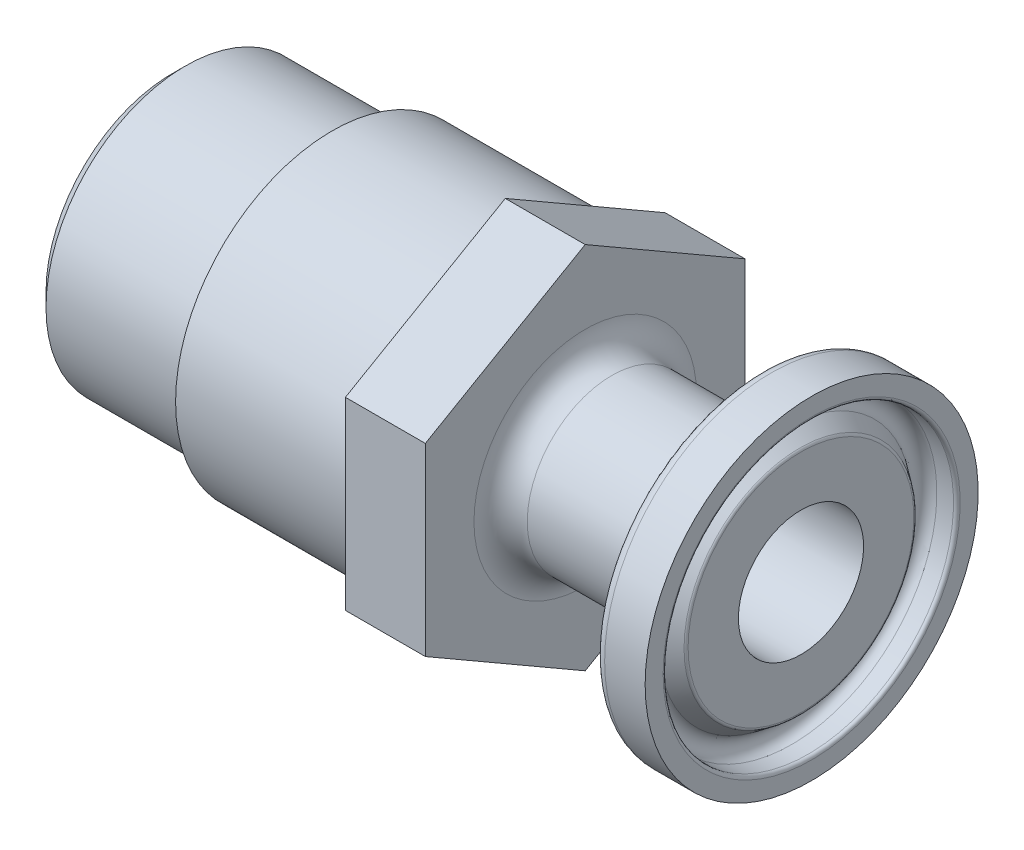
ISO-10303-21;
HEADER;
FILE_DESCRIPTION(('STEP AP214'),'2;1');
FILE_NAME('part.step','',(''),(''),'','','');
FILE_SCHEMA(('AUTOMOTIVE_DESIGN { 1 0 10303 214 1 1 1 1 }'));
ENDSEC;
DATA;
#1=APPLICATION_CONTEXT('core data for automotive mechanical design processes');
#2=APPLICATION_PROTOCOL_DEFINITION('international standard','automotive_design',2000,#1);
#3=PRODUCT_CONTEXT('',#1,'mechanical');
#4=PRODUCT('Part','Part','',(#3));
#5=PRODUCT_RELATED_PRODUCT_CATEGORY('part','',(#4));
#6=PRODUCT_DEFINITION_FORMATION('','',#4);
#7=PRODUCT_DEFINITION_CONTEXT('part definition',#1,'design');
#8=PRODUCT_DEFINITION('design','',#6,#7);
#9=PRODUCT_DEFINITION_SHAPE('','',#8);
#10=(LENGTH_UNIT() NAMED_UNIT(*) SI_UNIT(.MILLI.,.METRE.));
#11=(NAMED_UNIT(*) PLANE_ANGLE_UNIT() SI_UNIT($,.RADIAN.));
#12=(NAMED_UNIT(*) SI_UNIT($,.STERADIAN.) SOLID_ANGLE_UNIT());
#13=UNCERTAINTY_MEASURE_WITH_UNIT(LENGTH_MEASURE(1.E-05),#10,'distance_accuracy_value','');
#14=(GEOMETRIC_REPRESENTATION_CONTEXT(3) GLOBAL_UNCERTAINTY_ASSIGNED_CONTEXT((#13)) GLOBAL_UNIT_ASSIGNED_CONTEXT((#10,
#11,#12)) REPRESENTATION_CONTEXT('',''));
#15=CARTESIAN_POINT('',(0.,0.,0.));
#16=DIRECTION('',(0.,0.,1.));
#17=DIRECTION('',(1.,0.,0.));
#18=AXIS2_PLACEMENT_3D('',#15,#16,#17);
#19=CARTESIAN_POINT('',(25.,11.75,0.));
#20=DIRECTION('',(1.,0.,0.));
#21=DIRECTION('',(0.,0.,-1.));
#22=AXIS2_PLACEMENT_3D('',#19,#20,#21);
#23=PLANE('',#22);
#24=CARTESIAN_POINT('',(25.,0.,0.));
#25=DIRECTION('',(-1.,0.,0.));
#26=DIRECTION('',(0.,0.,1.));
#27=AXIS2_PLACEMENT_3D('',#24,#25,#26);
#28=CIRCLE('',#27,11.75);
#29=CARTESIAN_POINT('',(25.,0.,11.75));
#30=VERTEX_POINT('',#29);
#31=EDGE_CURVE('E155',#30,#30,#28,.T.);
#32=ORIENTED_EDGE('',*,*,#31,.F.);
#33=EDGE_LOOP('',(#32));
#34=FACE_BOUND('',#33,.T.);
#35=DIRECTION('',(0.,1.,0.));
#36=VECTOR('',#35,1.);
#37=CARTESIAN_POINT('',(25.,11.75,-12.));
#38=LINE('',#37,#36);
#39=CARTESIAN_POINT('',(25.,-6.92820323027551,-12.));
#40=VERTEX_POINT('',#39);
#41=CARTESIAN_POINT('',(25.,6.92820323027551,-12.));
#42=VERTEX_POINT('',#41);
#43=EDGE_CURVE('E127',#40,#42,#38,.T.);
#44=ORIENTED_EDGE('',*,*,#43,.F.);
#45=DIRECTION('',(0.,0.5,-0.866025403784439));
#46=VECTOR('',#45,1.);
#47=CARTESIAN_POINT('',(25.,-7.45480484541326,-11.0878992472336));
#48=LINE('',#47,#46);
#49=CARTESIAN_POINT('',(25.,-13.856406460551,0.));
#50=VERTEX_POINT('',#49);
#51=EDGE_CURVE('E128',#50,#40,#48,.T.);
#52=ORIENTED_EDGE('',*,*,#51,.F.);
#53=DIRECTION('',(0.,-0.5,-0.866025403784439));
#54=VECTOR('',#53,1.);
#55=CARTESIAN_POINT('',(25.,-7.45480484541326,11.0878992472336));
#56=LINE('',#55,#54);
#57=CARTESIAN_POINT('',(25.,-6.92820323027551,12.));
#58=VERTEX_POINT('',#57);
#59=EDGE_CURVE('E101',#58,#50,#56,.T.);
#60=ORIENTED_EDGE('',*,*,#59,.F.);
#61=DIRECTION('',(0.,-1.,0.));
#62=VECTOR('',#61,1.);
#63=CARTESIAN_POINT('',(25.,11.75,12.));
#64=LINE('',#63,#62);
#65=CARTESIAN_POINT('',(25.,6.92820323027551,12.));
#66=VERTEX_POINT('',#65);
#67=EDGE_CURVE('E139',#66,#58,#64,.T.);
#68=ORIENTED_EDGE('',*,*,#67,.F.);
#69=DIRECTION('',(0.,-0.5,0.866025403784439));
#70=VECTOR('',#69,1.);
#71=CARTESIAN_POINT('',(25.,13.3298048454133,0.912100752766424));
#72=LINE('',#71,#70);
#73=CARTESIAN_POINT('',(25.,13.856406460551,0.));
#74=VERTEX_POINT('',#73);
#75=EDGE_CURVE('E141',#74,#66,#72,.T.);
#76=ORIENTED_EDGE('',*,*,#75,.F.);
#77=DIRECTION('',(0.,0.5,0.866025403784439));
#78=VECTOR('',#77,1.);
#79=CARTESIAN_POINT('',(25.,13.3298048454133,-0.912100752766424));
#80=LINE('',#79,#78);
#81=EDGE_CURVE('E143',#42,#74,#80,.T.);
#82=ORIENTED_EDGE('',*,*,#81,.F.);
#83=EDGE_LOOP('',(#44,#52,#60,#68,#76,#82));
#84=FACE_BOUND('',#83,.T.);
#85=ADVANCED_FACE('F39',(#34,#84),#23,.F.);
#86=CARTESIAN_POINT('',(31.,8.35,0.));
#87=DIRECTION('',(-1.,0.,0.));
#88=DIRECTION('',(0.,0.,1.));
#89=AXIS2_PLACEMENT_3D('',#86,#87,#88);
#90=PLANE('',#89);
#91=CARTESIAN_POINT('',(31.,0.,0.));
#92=DIRECTION('',(-1.,0.,0.));
#93=DIRECTION('',(0.,0.,1.));
#94=AXIS2_PLACEMENT_3D('',#91,#92,#93);
#95=CIRCLE('',#94,8.35);
#96=CARTESIAN_POINT('',(31.,0.,8.35));
#97=VERTEX_POINT('',#96);
#98=EDGE_CURVE('E152',#97,#97,#95,.T.);
#99=ORIENTED_EDGE('',*,*,#98,.T.);
#100=EDGE_LOOP('',(#99));
#101=FACE_BOUND('',#100,.T.);
#102=DIRECTION('',(0.,-1.,0.));
#103=VECTOR('',#102,1.);
#104=CARTESIAN_POINT('',(31.,8.35,-12.));
#105=LINE('',#104,#103);
#106=CARTESIAN_POINT('',(31.,6.92820323027551,-12.));
#107=VERTEX_POINT('',#106);
#108=CARTESIAN_POINT('',(31.,-6.92820323027551,-12.));
#109=VERTEX_POINT('',#108);
#110=EDGE_CURVE('E12',#107,#109,#105,.T.);
#111=ORIENTED_EDGE('',*,*,#110,.F.);
#112=DIRECTION('',(0.,-0.5,-0.866025403784439));
#113=VECTOR('',#112,1.);
#114=CARTESIAN_POINT('',(31.,12.4798048454133,-2.38434393919997));
#115=LINE('',#114,#113);
#116=CARTESIAN_POINT('',(31.,13.856406460551,0.));
#117=VERTEX_POINT('',#116);
#118=EDGE_CURVE('E47',#117,#107,#115,.T.);
#119=ORIENTED_EDGE('',*,*,#118,.F.);
#120=DIRECTION('',(0.,0.5,-0.866025403784439));
#121=VECTOR('',#120,1.);
#122=CARTESIAN_POINT('',(31.,12.4798048454133,2.38434393919997));
#123=LINE('',#122,#121);
#124=CARTESIAN_POINT('',(31.,6.92820323027551,12.));
#125=VERTEX_POINT('',#124);
#126=EDGE_CURVE('E110',#125,#117,#123,.T.);
#127=ORIENTED_EDGE('',*,*,#126,.F.);
#128=DIRECTION('',(0.,1.,0.));
#129=VECTOR('',#128,1.);
#130=CARTESIAN_POINT('',(31.,8.35,12.));
#131=LINE('',#130,#129);
#132=CARTESIAN_POINT('',(31.,-6.92820323027551,12.));
#133=VERTEX_POINT('',#132);
#134=EDGE_CURVE('E108',#133,#125,#131,.T.);
#135=ORIENTED_EDGE('',*,*,#134,.F.);
#136=DIRECTION('',(0.,0.5,0.866025403784439));
#137=VECTOR('',#136,1.);
#138=CARTESIAN_POINT('',(31.,-8.30480484541326,9.61565606080003));
#139=LINE('',#138,#137);
#140=CARTESIAN_POINT('',(31.,-13.856406460551,0.));
#141=VERTEX_POINT('',#140);
#142=EDGE_CURVE('E93',#141,#133,#139,.T.);
#143=ORIENTED_EDGE('',*,*,#142,.F.);
#144=DIRECTION('',(0.,-0.5,0.866025403784439));
#145=VECTOR('',#144,1.);
#146=CARTESIAN_POINT('',(31.,-8.30480484541326,-9.61565606080003));
#147=LINE('',#146,#145);
#148=EDGE_CURVE('E88',#109,#141,#147,.T.);
#149=ORIENTED_EDGE('',*,*,#148,.F.);
#150=EDGE_LOOP('',(#111,#119,#127,#135,#143,#149));
#151=FACE_BOUND('',#150,.T.);
#152=ADVANCED_FACE('F106',(#101,#151),#90,.F.);
#153=CARTESIAN_POINT('',(40.7611679828434,0.,0.));
#154=DIRECTION('',(-1.,0.,0.));
#155=DIRECTION('',(0.,0.,1.));
#156=AXIS2_PLACEMENT_3D('',#153,#154,#155);
#157=TOROIDAL_SURFACE('',#156,8.35,2.);
#158=CARTESIAN_POINT('',(40.7611679828434,0.,0.));
#159=DIRECTION('',(-1.,0.,0.));
#160=DIRECTION('',(0.,0.,1.));
#161=AXIS2_PLACEMENT_3D('',#158,#159,#160);
#162=CIRCLE('',#161,6.35);
#163=CARTESIAN_POINT('',(40.7611679828434,0.,6.35));
#164=VERTEX_POINT('',#163);
#165=EDGE_CURVE('E146',#164,#164,#162,.T.);
#166=ORIENTED_EDGE('',*,*,#165,.F.);
#167=EDGE_LOOP('',(#166));
#168=FACE_BOUND('',#167,.T.);
#169=CARTESIAN_POINT('',(42.6405532244153,0.,0.));
#170=DIRECTION('',(-1.,0.,0.));
#171=DIRECTION('',(0.,0.,1.));
#172=AXIS2_PLACEMENT_3D('',#169,#170,#171);
#173=CIRCLE('',#172,7.66595971334866);
#174=CARTESIAN_POINT('',(42.6405532244153,0.,7.66595971334866));
#175=VERTEX_POINT('',#174);
#176=EDGE_CURVE('E94',#175,#175,#173,.T.);
#177=ORIENTED_EDGE('',*,*,#176,.T.);
#178=EDGE_LOOP('',(#177));
#179=FACE_BOUND('',#178,.T.);
#180=ADVANCED_FACE('F41',(#168,#179),#157,.F.);
#181=CARTESIAN_POINT('',(44.2084119339391,0.,0.));
#182=DIRECTION('',(1.,0.,0.));
#183=DIRECTION('',(0.,0.,-1.));
#184=AXIS2_PLACEMENT_3D('',#181,#182,#183);
#185=CONICAL_SURFACE('',#184,11.9736161146605,1.22173047639603);
#186=ORIENTED_EDGE('',*,*,#176,.F.);
#187=EDGE_LOOP('',(#186));
#188=FACE_BOUND('',#187,.T.);
#189=CARTESIAN_POINT('',(44.2084119339391,0.,0.));
#190=DIRECTION('',(-1.,0.,0.));
#191=DIRECTION('',(0.,0.,1.));
#192=AXIS2_PLACEMENT_3D('',#189,#190,#191);
#193=CIRCLE('',#192,11.9736161146605);
#194=CARTESIAN_POINT('',(44.2084119339391,0.,11.9736161146605));
#195=VERTEX_POINT('',#194);
#196=EDGE_CURVE('E203',#195,#195,#193,.T.);
#197=ORIENTED_EDGE('',*,*,#196,.T.);
#198=EDGE_LOOP('',(#197));
#199=FACE_BOUND('',#198,.T.);
#200=ADVANCED_FACE('F209',(#188,#199),#185,.T.);
#201=CARTESIAN_POINT('',(44.9601660305678,0.,0.));
#202=DIRECTION('',(-1.,0.,0.));
#203=DIRECTION('',(0.,0.,1.));
#204=AXIS2_PLACEMENT_3D('',#201,#202,#203);
#205=TOROIDAL_SURFACE('',#204,11.7,0.8);
#206=ORIENTED_EDGE('',*,*,#196,.F.);
#207=EDGE_LOOP('',(#206));
#208=FACE_BOUND('',#207,.T.);
#209=CARTESIAN_POINT('',(44.9601660305678,0.,0.));
#210=DIRECTION('',(-1.,0.,0.));
#211=DIRECTION('',(0.,0.,1.));
#212=AXIS2_PLACEMENT_3D('',#209,#210,#211);
#213=CIRCLE('',#212,12.5);
#214=CARTESIAN_POINT('',(44.9601660305678,0.,12.5));
#215=VERTEX_POINT('',#214);
#216=EDGE_CURVE('E200',#215,#215,#213,.T.);
#217=ORIENTED_EDGE('',*,*,#216,.T.);
#218=EDGE_LOOP('',(#217));
#219=FACE_BOUND('',#218,.T.);
#220=ADVANCED_FACE('F212',(#208,#219),#205,.T.);
#221=CARTESIAN_POINT('',(0.,0.,0.));
#222=DIRECTION('',(-1.,0.,0.));
#223=DIRECTION('',(0.,0.,1.));
#224=AXIS2_PLACEMENT_3D('',#221,#222,#223);
#225=CYLINDRICAL_SURFACE('',#224,12.5);
#226=ORIENTED_EDGE('',*,*,#216,.F.);
#227=EDGE_LOOP('',(#226));
#228=FACE_BOUND('',#227,.T.);
#229=CARTESIAN_POINT('',(48.,0.,0.));
#230=DIRECTION('',(-1.,0.,0.));
#231=DIRECTION('',(0.,0.,1.));
#232=AXIS2_PLACEMENT_3D('',#229,#230,#231);
#233=CIRCLE('',#232,12.5);
#234=CARTESIAN_POINT('',(48.,0.,12.5));
#235=VERTEX_POINT('',#234);
#236=EDGE_CURVE('E197',#235,#235,#233,.T.);
#237=ORIENTED_EDGE('',*,*,#236,.T.);
#238=EDGE_LOOP('',(#237));
#239=FACE_BOUND('',#238,.T.);
#240=ADVANCED_FACE('F217',(#228,#239),#225,.T.);
#241=CARTESIAN_POINT('',(48.,11.15,0.));
#242=DIRECTION('',(-1.,0.,0.));
#243=DIRECTION('',(0.,0.,1.));
#244=AXIS2_PLACEMENT_3D('',#241,#242,#243);
#245=PLANE('',#244);
#246=ORIENTED_EDGE('',*,*,#236,.F.);
#247=EDGE_LOOP('',(#246));
#248=FACE_BOUND('',#247,.T.);
#249=CARTESIAN_POINT('',(48.,0.,0.));
#250=DIRECTION('',(-1.,0.,0.));
#251=DIRECTION('',(0.,0.,1.));
#252=AXIS2_PLACEMENT_3D('',#249,#250,#251);
#253=CIRCLE('',#252,11.15);
#254=CARTESIAN_POINT('',(48.,0.,11.15));
#255=VERTEX_POINT('',#254);
#256=EDGE_CURVE('E194',#255,#255,#253,.T.);
#257=ORIENTED_EDGE('',*,*,#256,.T.);
#258=EDGE_LOOP('',(#257));
#259=FACE_BOUND('',#258,.T.);
#260=ADVANCED_FACE('F223',(#248,#259),#245,.F.);
#261=CARTESIAN_POINT('',(47.75,0.,0.));
#262=DIRECTION('',(-1.,0.,0.));
#263=DIRECTION('',(0.,0.,1.));
#264=AXIS2_PLACEMENT_3D('',#261,#262,#263);
#265=TOROIDAL_SURFACE('',#264,11.15,0.249999999999999);
#266=ORIENTED_EDGE('',*,*,#256,.F.);
#267=EDGE_LOOP('',(#266));
#268=FACE_BOUND('',#267,.T.);
#269=CARTESIAN_POINT('',(47.75,0.,0.));
#270=DIRECTION('',(-1.,0.,0.));
#271=DIRECTION('',(0.,0.,1.));
#272=AXIS2_PLACEMENT_3D('',#269,#270,#271);
#273=CIRCLE('',#272,10.9);
#274=CARTESIAN_POINT('',(47.75,0.,10.9));
#275=VERTEX_POINT('',#274);
#276=EDGE_CURVE('E191',#275,#275,#273,.T.);
#277=ORIENTED_EDGE('',*,*,#276,.T.);
#278=EDGE_LOOP('',(#277));
#279=FACE_BOUND('',#278,.T.);
#280=ADVANCED_FACE('F229',(#268,#279),#265,.T.);
#281=CARTESIAN_POINT('',(0.,0.,0.));
#282=DIRECTION('',(-1.,0.,0.));
#283=DIRECTION('',(0.,0.,1.));
#284=AXIS2_PLACEMENT_3D('',#281,#282,#283);
#285=CYLINDRICAL_SURFACE('',#284,10.9);
#286=ORIENTED_EDGE('',*,*,#276,.F.);
#287=EDGE_LOOP('',(#286));
#288=FACE_BOUND('',#287,.T.);
#289=CARTESIAN_POINT('',(46.5,0.,0.));
#290=DIRECTION('',(-1.,0.,0.));
#291=DIRECTION('',(0.,0.,1.));
#292=AXIS2_PLACEMENT_3D('',#289,#290,#291);
#293=CIRCLE('',#292,10.9);
#294=CARTESIAN_POINT('',(46.5,0.,10.9));
#295=VERTEX_POINT('',#294);
#296=EDGE_CURVE('E188',#295,#295,#293,.T.);
#297=ORIENTED_EDGE('',*,*,#296,.T.);
#298=EDGE_LOOP('',(#297));
#299=FACE_BOUND('',#298,.T.);
#300=ADVANCED_FACE('F235',(#288,#299),#285,.F.);
#301=CARTESIAN_POINT('',(46.5,0.,0.));
#302=DIRECTION('',(-1.,0.,0.));
#303=DIRECTION('',(0.,0.,1.));
#304=AXIS2_PLACEMENT_3D('',#301,#302,#303);
#305=TOROIDAL_SURFACE('',#304,10.1,0.800000000000001);
#306=ORIENTED_EDGE('',*,*,#296,.F.);
#307=EDGE_LOOP('',(#306));
#308=FACE_BOUND('',#307,.T.);
#309=CARTESIAN_POINT('',(46.029771798166,0.,0.));
#310=DIRECTION('',(-1.,0.,0.));
#311=DIRECTION('',(0.,0.,1.));
#312=AXIS2_PLACEMENT_3D('',#309,#310,#311);
#313=CIRCLE('',#312,9.45278640450004);
#314=CARTESIAN_POINT('',(46.029771798166,0.,9.45278640450004));
#315=VERTEX_POINT('',#314);
#316=EDGE_CURVE('E185',#315,#315,#313,.T.);
#317=ORIENTED_EDGE('',*,*,#316,.T.);
#318=EDGE_LOOP('',(#317));
#319=FACE_BOUND('',#318,.T.);
#320=ADVANCED_FACE('F241',(#308,#319),#305,.F.);
#321=CARTESIAN_POINT('',(47.0969463130731,0.,0.));
#322=DIRECTION('',(-1.,0.,0.));
#323=DIRECTION('',(0.,0.,1.));
#324=AXIS2_PLACEMENT_3D('',#321,#322,#323);
#325=CONICAL_SURFACE('',#324,8.67743873461655,0.628318530717954);
#326=ORIENTED_EDGE('',*,*,#316,.F.);
#327=EDGE_LOOP('',(#326));
#328=FACE_BOUND('',#327,.T.);
#329=CARTESIAN_POINT('',(47.0969463130731,0.,0.));
#330=DIRECTION('',(-1.,0.,0.));
#331=DIRECTION('',(0.,0.,1.));
#332=AXIS2_PLACEMENT_3D('',#329,#330,#331);
#333=CIRCLE('',#332,8.67743873461655);
#334=CARTESIAN_POINT('',(47.0969463130731,0.,8.67743873461655));
#335=VERTEX_POINT('',#334);
#336=EDGE_CURVE('E182',#335,#335,#333,.T.);
#337=ORIENTED_EDGE('',*,*,#336,.T.);
#338=EDGE_LOOP('',(#337));
#339=FACE_BOUND('',#338,.T.);
#340=ADVANCED_FACE('F247',(#328,#339),#325,.T.);
#341=CARTESIAN_POINT('',(46.95,0.,0.));
#342=DIRECTION('',(-1.,0.,0.));
#343=DIRECTION('',(0.,0.,1.));
#344=AXIS2_PLACEMENT_3D('',#341,#342,#343);
#345=TOROIDAL_SURFACE('',#344,8.47518448602281,0.250000000000005);
#346=ORIENTED_EDGE('',*,*,#336,.F.);
#347=EDGE_LOOP('',(#346));
#348=FACE_BOUND('',#347,.T.);
#349=CARTESIAN_POINT('',(47.2,0.,0.));
#350=DIRECTION('',(-1.,0.,0.));
#351=DIRECTION('',(0.,0.,1.));
#352=AXIS2_PLACEMENT_3D('',#349,#350,#351);
#353=CIRCLE('',#352,8.47518448602281);
#354=CARTESIAN_POINT('',(47.2,0.,8.47518448602281));
#355=VERTEX_POINT('',#354);
#356=EDGE_CURVE('E179',#355,#355,#353,.T.);
#357=ORIENTED_EDGE('',*,*,#356,.T.);
#358=EDGE_LOOP('',(#357));
#359=FACE_BOUND('',#358,.T.);
#360=ADVANCED_FACE('F253',(#348,#359),#345,.T.);
#361=CARTESIAN_POINT('',(47.2,8.47518448602281,0.));
#362=DIRECTION('',(-1.,0.,0.));
#363=DIRECTION('',(0.,0.,1.));
#364=AXIS2_PLACEMENT_3D('',#361,#362,#363);
#365=PLANE('',#364);
#366=ORIENTED_EDGE('',*,*,#356,.F.);
#367=EDGE_LOOP('',(#366));
#368=FACE_BOUND('',#367,.T.);
#369=CARTESIAN_POINT('',(47.2,0.,0.));
#370=DIRECTION('',(-1.,0.,0.));
#371=DIRECTION('',(0.,0.,1.));
#372=AXIS2_PLACEMENT_3D('',#369,#370,#371);
#373=CIRCLE('',#372,4.7);
#374=CARTESIAN_POINT('',(47.2,0.,4.7));
#375=VERTEX_POINT('',#374);
#376=EDGE_CURVE('E176',#375,#375,#373,.T.);
#377=ORIENTED_EDGE('',*,*,#376,.T.);
#378=EDGE_LOOP('',(#377));
#379=FACE_BOUND('',#378,.T.);
#380=ADVANCED_FACE('F259',(#368,#379),#365,.F.);
#381=CARTESIAN_POINT('',(0.,0.,0.));
#382=DIRECTION('',(-1.,0.,0.));
#383=DIRECTION('',(0.,0.,1.));
#384=AXIS2_PLACEMENT_3D('',#381,#382,#383);
#385=CYLINDRICAL_SURFACE('',#384,4.7);
#386=ORIENTED_EDGE('',*,*,#376,.F.);
#387=EDGE_LOOP('',(#386));
#388=FACE_BOUND('',#387,.T.);
#389=CARTESIAN_POINT('',(0.,0.,0.));
#390=DIRECTION('',(-1.,0.,0.));
#391=DIRECTION('',(0.,0.,1.));
#392=AXIS2_PLACEMENT_3D('',#389,#390,#391);
#393=CIRCLE('',#392,4.7);
#394=CARTESIAN_POINT('',(0.,0.,4.7));
#395=VERTEX_POINT('',#394);
#396=EDGE_CURVE('E173',#395,#395,#393,.T.);
#397=ORIENTED_EDGE('',*,*,#396,.T.);
#398=EDGE_LOOP('',(#397));
#399=FACE_BOUND('',#398,.T.);
#400=ADVANCED_FACE('F265',(#388,#399),#385,.F.);
#401=CARTESIAN_POINT('',(0.,9.4775,0.));
#402=DIRECTION('',(1.,0.,0.));
#403=DIRECTION('',(0.,0.,-1.));
#404=AXIS2_PLACEMENT_3D('',#401,#402,#403);
#405=PLANE('',#404);
#406=ORIENTED_EDGE('',*,*,#396,.F.);
#407=EDGE_LOOP('',(#406));
#408=FACE_BOUND('',#407,.T.);
#409=CARTESIAN_POINT('',(0.,0.,0.));
#410=DIRECTION('',(-1.,0.,0.));
#411=DIRECTION('',(0.,0.,1.));
#412=AXIS2_PLACEMENT_3D('',#409,#410,#411);
#413=CIRCLE('',#412,9.4775);
#414=CARTESIAN_POINT('',(0.,0.,9.4775));
#415=VERTEX_POINT('',#414);
#416=EDGE_CURVE('E170',#415,#415,#413,.T.);
#417=ORIENTED_EDGE('',*,*,#416,.T.);
#418=EDGE_LOOP('',(#417));
#419=FACE_BOUND('',#418,.T.);
#420=ADVANCED_FACE('F271',(#408,#419),#405,.F.);
#421=CARTESIAN_POINT('',(1.,0.,0.));
#422=DIRECTION('',(1.,0.,0.));
#423=DIRECTION('',(0.,0.,-1.));
#424=AXIS2_PLACEMENT_3D('',#421,#422,#423);
#425=CONICAL_SURFACE('',#424,10.4775,0.78539816339745);
#426=ORIENTED_EDGE('',*,*,#416,.F.);
#427=EDGE_LOOP('',(#426));
#428=FACE_BOUND('',#427,.T.);
#429=CARTESIAN_POINT('',(1.,0.,0.));
#430=DIRECTION('',(-1.,0.,0.));
#431=DIRECTION('',(0.,0.,1.));
#432=AXIS2_PLACEMENT_3D('',#429,#430,#431);
#433=CIRCLE('',#432,10.4775);
#434=CARTESIAN_POINT('',(1.,0.,10.4775));
#435=VERTEX_POINT('',#434);
#436=EDGE_CURVE('E167',#435,#435,#433,.T.);
#437=ORIENTED_EDGE('',*,*,#436,.T.);
#438=EDGE_LOOP('',(#437));
#439=FACE_BOUND('',#438,.T.);
#440=ADVANCED_FACE('F277',(#428,#439),#425,.T.);
#441=CARTESIAN_POINT('',(0.,0.,0.));
#442=DIRECTION('',(-1.,0.,0.));
#443=DIRECTION('',(0.,0.,1.));
#444=AXIS2_PLACEMENT_3D('',#441,#442,#443);
#445=CYLINDRICAL_SURFACE('',#444,10.4775);
#446=ORIENTED_EDGE('',*,*,#436,.F.);
#447=EDGE_LOOP('',(#446));
#448=FACE_BOUND('',#447,.T.);
#449=CARTESIAN_POINT('',(11.5,0.,0.));
#450=DIRECTION('',(-1.,0.,0.));
#451=DIRECTION('',(0.,0.,1.));
#452=AXIS2_PLACEMENT_3D('',#449,#450,#451);
#453=CIRCLE('',#452,10.4775);
#454=CARTESIAN_POINT('',(11.5,0.,10.4775));
#455=VERTEX_POINT('',#454);
#456=EDGE_CURVE('E164',#455,#455,#453,.T.);
#457=ORIENTED_EDGE('',*,*,#456,.T.);
#458=EDGE_LOOP('',(#457));
#459=FACE_BOUND('',#458,.T.);
#460=ADVANCED_FACE('F283',(#448,#459),#445,.T.);
#461=CARTESIAN_POINT('',(11.5,0.,0.));
#462=DIRECTION('',(-1.,0.,0.));
#463=DIRECTION('',(0.,0.,1.));
#464=AXIS2_PLACEMENT_3D('',#461,#462,#463);
#465=TOROIDAL_SURFACE('',#464,10.9775,0.5);
#466=ORIENTED_EDGE('',*,*,#456,.F.);
#467=EDGE_LOOP('',(#466));
#468=FACE_BOUND('',#467,.T.);
#469=CARTESIAN_POINT('',(12.,0.,0.));
#470=DIRECTION('',(-1.,0.,0.));
#471=DIRECTION('',(0.,0.,1.));
#472=AXIS2_PLACEMENT_3D('',#469,#470,#471);
#473=CIRCLE('',#472,10.9775);
#474=CARTESIAN_POINT('',(12.,0.,10.9775));
#475=VERTEX_POINT('',#474);
#476=EDGE_CURVE('E161',#475,#475,#473,.T.);
#477=ORIENTED_EDGE('',*,*,#476,.T.);
#478=EDGE_LOOP('',(#477));
#479=FACE_BOUND('',#478,.T.);
#480=ADVANCED_FACE('F289',(#468,#479),#465,.F.);
#481=CARTESIAN_POINT('',(12.,11.75,0.));
#482=DIRECTION('',(1.,0.,0.));
#483=DIRECTION('',(0.,0.,-1.));
#484=AXIS2_PLACEMENT_3D('',#481,#482,#483);
#485=PLANE('',#484);
#486=ORIENTED_EDGE('',*,*,#476,.F.);
#487=EDGE_LOOP('',(#486));
#488=FACE_BOUND('',#487,.T.);
#489=CARTESIAN_POINT('',(12.,0.,0.));
#490=DIRECTION('',(-1.,0.,0.));
#491=DIRECTION('',(0.,0.,1.));
#492=AXIS2_PLACEMENT_3D('',#489,#490,#491);
#493=CIRCLE('',#492,11.75);
#494=CARTESIAN_POINT('',(12.,0.,11.75));
#495=VERTEX_POINT('',#494);
#496=EDGE_CURVE('E158',#495,#495,#493,.T.);
#497=ORIENTED_EDGE('',*,*,#496,.T.);
#498=EDGE_LOOP('',(#497));
#499=FACE_BOUND('',#498,.T.);
#500=ADVANCED_FACE('F295',(#488,#499),#485,.F.);
#501=CARTESIAN_POINT('',(0.,0.,0.));
#502=DIRECTION('',(-1.,0.,0.));
#503=DIRECTION('',(0.,0.,1.));
#504=AXIS2_PLACEMENT_3D('',#501,#502,#503);
#505=CYLINDRICAL_SURFACE('',#504,11.75);
#506=ORIENTED_EDGE('',*,*,#496,.F.);
#507=EDGE_LOOP('',(#506));
#508=FACE_BOUND('',#507,.T.);
#509=ORIENTED_EDGE('',*,*,#31,.T.);
#510=EDGE_LOOP('',(#509));
#511=FACE_BOUND('',#510,.T.);
#512=ADVANCED_FACE('F301',(#508,#511),#505,.T.);
#513=CARTESIAN_POINT('',(33.,0.,0.));
#514=DIRECTION('',(-1.,0.,0.));
#515=DIRECTION('',(0.,0.,1.));
#516=AXIS2_PLACEMENT_3D('',#513,#514,#515);
#517=TOROIDAL_SURFACE('',#516,8.35,2.);
#518=ORIENTED_EDGE('',*,*,#98,.F.);
#519=EDGE_LOOP('',(#518));
#520=FACE_BOUND('',#519,.T.);
#521=CARTESIAN_POINT('',(33.,0.,0.));
#522=DIRECTION('',(-1.,0.,0.));
#523=DIRECTION('',(0.,0.,1.));
#524=AXIS2_PLACEMENT_3D('',#521,#522,#523);
#525=CIRCLE('',#524,6.35);
#526=CARTESIAN_POINT('',(33.,0.,6.35));
#527=VERTEX_POINT('',#526);
#528=EDGE_CURVE('E149',#527,#527,#525,.T.);
#529=ORIENTED_EDGE('',*,*,#528,.T.);
#530=EDGE_LOOP('',(#529));
#531=FACE_BOUND('',#530,.T.);
#532=ADVANCED_FACE('F307',(#520,#531),#517,.F.);
#533=CARTESIAN_POINT('',(0.,0.,0.));
#534=DIRECTION('',(-1.,0.,0.));
#535=DIRECTION('',(0.,0.,1.));
#536=AXIS2_PLACEMENT_3D('',#533,#534,#535);
#537=CYLINDRICAL_SURFACE('',#536,6.35);
#538=ORIENTED_EDGE('',*,*,#528,.F.);
#539=EDGE_LOOP('',(#538));
#540=FACE_BOUND('',#539,.T.);
#541=ORIENTED_EDGE('',*,*,#165,.T.);
#542=EDGE_LOOP('',(#541));
#543=FACE_BOUND('',#542,.T.);
#544=ADVANCED_FACE('F335',(#540,#543),#537,.T.);
#545=CARTESIAN_POINT('',(38.,6.92820323027551,-12.));
#546=DIRECTION('',(0.,0.,-1.));
#547=DIRECTION('',(-1.,0.,0.));
#548=AXIS2_PLACEMENT_3D('',#545,#546,#547);
#549=PLANE('',#548);
#550=ORIENTED_EDGE('',*,*,#43,.T.);
#551=DIRECTION('',(-1.,0.,0.));
#552=VECTOR('',#551,1.);
#553=CARTESIAN_POINT('',(38.,6.92820323027551,-12.));
#554=LINE('',#553,#552);
#555=EDGE_CURVE('E120',#107,#42,#554,.T.);
#556=ORIENTED_EDGE('',*,*,#555,.F.);
#557=ORIENTED_EDGE('',*,*,#110,.T.);
#558=DIRECTION('',(-1.,0.,0.));
#559=VECTOR('',#558,1.);
#560=CARTESIAN_POINT('',(38.,-6.92820323027551,-12.));
#561=LINE('',#560,#559);
#562=EDGE_CURVE('E59',#109,#40,#561,.T.);
#563=ORIENTED_EDGE('',*,*,#562,.T.);
#564=EDGE_LOOP('',(#550,#556,#557,#563));
#565=FACE_BOUND('',#564,.T.);
#566=ADVANCED_FACE('F125',(#565),#549,.T.);
#567=CARTESIAN_POINT('',(38.,13.856406460551,0.));
#568=DIRECTION('',(0.,0.866025403784439,-0.5));
#569=DIRECTION('',(0.,0.5,0.866025403784439));
#570=AXIS2_PLACEMENT_3D('',#567,#568,#569);
#571=PLANE('',#570);
#572=ORIENTED_EDGE('',*,*,#81,.T.);
#573=DIRECTION('',(-1.,0.,0.));
#574=VECTOR('',#573,1.);
#575=CARTESIAN_POINT('',(38.,13.856406460551,0.));
#576=LINE('',#575,#574);
#577=EDGE_CURVE('E123',#117,#74,#576,.T.);
#578=ORIENTED_EDGE('',*,*,#577,.F.);
#579=ORIENTED_EDGE('',*,*,#118,.T.);
#580=ORIENTED_EDGE('',*,*,#555,.T.);
#581=EDGE_LOOP('',(#572,#578,#579,#580));
#582=FACE_BOUND('',#581,.T.);
#583=ADVANCED_FACE('F119',(#582),#571,.T.);
#584=CARTESIAN_POINT('',(38.,6.92820323027551,12.));
#585=DIRECTION('',(0.,0.866025403784439,0.5));
#586=DIRECTION('',(0.,-0.5,0.866025403784439));
#587=AXIS2_PLACEMENT_3D('',#584,#585,#586);
#588=PLANE('',#587);
#589=ORIENTED_EDGE('',*,*,#75,.T.);
#590=DIRECTION('',(-1.,0.,0.));
#591=VECTOR('',#590,1.);
#592=CARTESIAN_POINT('',(38.,6.92820323027551,12.));
#593=LINE('',#592,#591);
#594=EDGE_CURVE('E131',#125,#66,#593,.T.);
#595=ORIENTED_EDGE('',*,*,#594,.F.);
#596=ORIENTED_EDGE('',*,*,#126,.T.);
#597=ORIENTED_EDGE('',*,*,#577,.T.);
#598=EDGE_LOOP('',(#589,#595,#596,#597));
#599=FACE_BOUND('',#598,.T.);
#600=ADVANCED_FACE('F317',(#599),#588,.T.);
#601=CARTESIAN_POINT('',(38.,-6.92820323027551,12.));
#602=DIRECTION('',(0.,0.,1.));
#603=DIRECTION('',(1.,0.,0.));
#604=AXIS2_PLACEMENT_3D('',#601,#602,#603);
#605=PLANE('',#604);
#606=ORIENTED_EDGE('',*,*,#67,.T.);
#607=DIRECTION('',(-1.,0.,0.));
#608=VECTOR('',#607,1.);
#609=CARTESIAN_POINT('',(38.,-6.92820323027551,12.));
#610=LINE('',#609,#608);
#611=EDGE_CURVE('E103',#133,#58,#610,.T.);
#612=ORIENTED_EDGE('',*,*,#611,.F.);
#613=ORIENTED_EDGE('',*,*,#134,.T.);
#614=ORIENTED_EDGE('',*,*,#594,.T.);
#615=EDGE_LOOP('',(#606,#612,#613,#614));
#616=FACE_BOUND('',#615,.T.);
#617=ADVANCED_FACE('F320',(#616),#605,.T.);
#618=CARTESIAN_POINT('',(38.,-13.856406460551,0.));
#619=DIRECTION('',(0.,-0.866025403784439,0.5));
#620=DIRECTION('',(0.,-0.5,-0.866025403784439));
#621=AXIS2_PLACEMENT_3D('',#618,#619,#620);
#622=PLANE('',#621);
#623=ORIENTED_EDGE('',*,*,#59,.T.);
#624=DIRECTION('',(-1.,0.,0.));
#625=VECTOR('',#624,1.);
#626=CARTESIAN_POINT('',(38.,-13.856406460551,0.));
#627=LINE('',#626,#625);
#628=EDGE_CURVE('E54',#141,#50,#627,.T.);
#629=ORIENTED_EDGE('',*,*,#628,.F.);
#630=ORIENTED_EDGE('',*,*,#142,.T.);
#631=ORIENTED_EDGE('',*,*,#611,.T.);
#632=EDGE_LOOP('',(#623,#629,#630,#631));
#633=FACE_BOUND('',#632,.T.);
#634=ADVANCED_FACE('F97',(#633),#622,.T.);
#635=CARTESIAN_POINT('',(38.,-6.92820323027551,-12.));
#636=DIRECTION('',(0.,-0.866025403784439,-0.5));
#637=DIRECTION('',(0.,0.5,-0.866025403784439));
#638=AXIS2_PLACEMENT_3D('',#635,#636,#637);
#639=PLANE('',#638);
#640=ORIENTED_EDGE('',*,*,#51,.T.);
#641=ORIENTED_EDGE('',*,*,#562,.F.);
#642=ORIENTED_EDGE('',*,*,#148,.T.);
#643=ORIENTED_EDGE('',*,*,#628,.T.);
#644=EDGE_LOOP('',(#640,#641,#642,#643));
#645=FACE_BOUND('',#644,.T.);
#646=ADVANCED_FACE('F89',(#645),#639,.T.);
#647=CLOSED_SHELL('',(#85,#152,#180,#200,#220,#240,#260,#280,#300,#320,#340,#360,#380,#400,#420,
#440,#460,#480,#500,#512,#532,#544,#566,#583,#600,#617,#634,#646));
#648=MANIFOLD_SOLID_BREP('B2',#647);
#649=ADVANCED_BREP_SHAPE_REPRESENTATION('',(#18,#648),#14);
#650=SHAPE_DEFINITION_REPRESENTATION(#9,#649);
ENDSEC;
END-ISO-10303-21;
